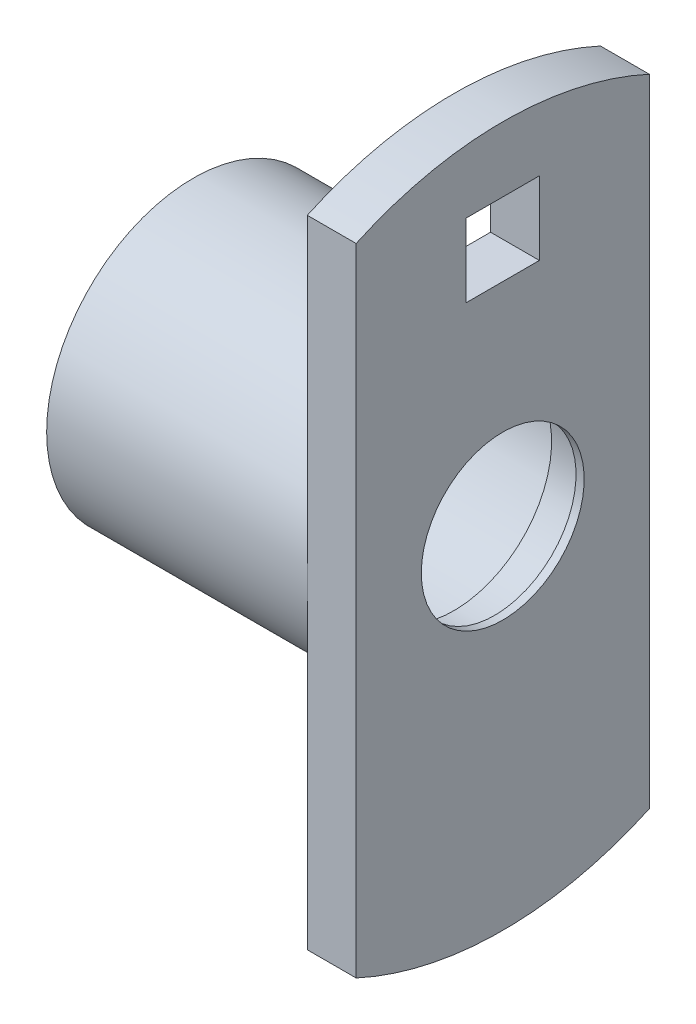
ISO-10303-21;
HEADER;
FILE_DESCRIPTION(('STEP AP214'),'2;1');
FILE_NAME('part.step','',(''),(''),'','','');
FILE_SCHEMA(('AUTOMOTIVE_DESIGN { 1 0 10303 214 1 1 1 1 }'));
ENDSEC;
DATA;
#1=APPLICATION_CONTEXT('core data for automotive mechanical design processes');
#2=APPLICATION_PROTOCOL_DEFINITION('international standard','automotive_design',2000,#1);
#3=PRODUCT_CONTEXT('',#1,'mechanical');
#4=PRODUCT('Part','Part','',(#3));
#5=PRODUCT_RELATED_PRODUCT_CATEGORY('part','',(#4));
#6=PRODUCT_DEFINITION_FORMATION('','',#4);
#7=PRODUCT_DEFINITION_CONTEXT('part definition',#1,'design');
#8=PRODUCT_DEFINITION('design','',#6,#7);
#9=PRODUCT_DEFINITION_SHAPE('','',#8);
#10=(LENGTH_UNIT() NAMED_UNIT(*) SI_UNIT(.MILLI.,.METRE.));
#11=(NAMED_UNIT(*) PLANE_ANGLE_UNIT() SI_UNIT($,.RADIAN.));
#12=(NAMED_UNIT(*) SI_UNIT($,.STERADIAN.) SOLID_ANGLE_UNIT());
#13=UNCERTAINTY_MEASURE_WITH_UNIT(LENGTH_MEASURE(1.E-05),#10,'distance_accuracy_value','');
#14=(GEOMETRIC_REPRESENTATION_CONTEXT(3) GLOBAL_UNCERTAINTY_ASSIGNED_CONTEXT((#13)) GLOBAL_UNIT_ASSIGNED_CONTEXT((#10,
#11,#12)) REPRESENTATION_CONTEXT('',''));
#15=CARTESIAN_POINT('',(0.,0.,0.));
#16=DIRECTION('',(0.,0.,1.));
#17=DIRECTION('',(1.,0.,0.));
#18=AXIS2_PLACEMENT_3D('',#15,#16,#17);
#19=CARTESIAN_POINT('',(0.,43.,0.));
#20=DIRECTION('',(-1.,0.,0.));
#21=DIRECTION('',(0.,0.,1.));
#22=AXIS2_PLACEMENT_3D('',#19,#20,#21);
#23=PLANE('',#22);
#24=CARTESIAN_POINT('',(0.,0.,0.));
#25=DIRECTION('',(-1.,0.,0.));
#26=DIRECTION('',(0.,0.,1.));
#27=AXIS2_PLACEMENT_3D('',#24,#25,#26);
#28=CIRCLE('',#27,10.);
#29=CARTESIAN_POINT('',(0.,0.,10.));
#30=VERTEX_POINT('',#29);
#31=EDGE_CURVE('E53',#30,#30,#28,.T.);
#32=ORIENTED_EDGE('',*,*,#31,.T.);
#33=EDGE_LOOP('',(#32));
#34=FACE_BOUND('',#33,.T.);
#35=DIRECTION('',(0.,1.,0.));
#36=VECTOR('',#35,1.);
#37=CARTESIAN_POINT('',(0.,0.,-4.5));
#38=LINE('',#37,#36);
#39=CARTESIAN_POINT('',(0.,26.,-4.5));
#40=VERTEX_POINT('',#39);
#41=CARTESIAN_POINT('',(0.,35.,-4.5));
#42=VERTEX_POINT('',#41);
#43=EDGE_CURVE('E192',#40,#42,#38,.T.);
#44=ORIENTED_EDGE('',*,*,#43,.F.);
#45=DIRECTION('',(0.,0.,-1.));
#46=VECTOR('',#45,1.);
#47=CARTESIAN_POINT('',(0.,26.,0.));
#48=LINE('',#47,#46);
#49=CARTESIAN_POINT('',(0.,26.,4.5));
#50=VERTEX_POINT('',#49);
#51=EDGE_CURVE('E60',#50,#40,#48,.T.);
#52=ORIENTED_EDGE('',*,*,#51,.F.);
#53=DIRECTION('',(0.,1.,0.));
#54=VECTOR('',#53,1.);
#55=CARTESIAN_POINT('',(0.,0.,4.5));
#56=LINE('',#55,#54);
#57=CARTESIAN_POINT('',(0.,35.,4.5));
#58=VERTEX_POINT('',#57);
#59=EDGE_CURVE('E180',#50,#58,#56,.T.);
#60=ORIENTED_EDGE('',*,*,#59,.T.);
#61=DIRECTION('',(0.,0.,-1.));
#62=VECTOR('',#61,1.);
#63=CARTESIAN_POINT('',(0.,35.,0.));
#64=LINE('',#63,#62);
#65=EDGE_CURVE('E189',#58,#42,#64,.T.);
#66=ORIENTED_EDGE('',*,*,#65,.T.);
#67=EDGE_LOOP('',(#44,#52,#60,#66));
#68=FACE_BOUND('',#67,.T.);
#69=DIRECTION('',(0.,-1.,0.));
#70=VECTOR('',#69,1.);
#71=CARTESIAN_POINT('',(0.,0.,18.));
#72=LINE('',#71,#70);
#73=CARTESIAN_POINT('',(0.,39.0512483795333,18.));
#74=VERTEX_POINT('',#73);
#75=CARTESIAN_POINT('',(0.,-39.0512483795333,18.));
#76=VERTEX_POINT('',#75);
#77=EDGE_CURVE('E116',#74,#76,#72,.T.);
#78=ORIENTED_EDGE('',*,*,#77,.T.);
#79=CARTESIAN_POINT('',(0.,0.,0.));
#80=DIRECTION('',(-1.,0.,0.));
#81=DIRECTION('',(0.,0.,1.));
#82=AXIS2_PLACEMENT_3D('',#79,#80,#81);
#83=CIRCLE('',#82,43.);
#84=CARTESIAN_POINT('',(0.,-39.0512483795333,-18.));
#85=VERTEX_POINT('',#84);
#86=EDGE_CURVE('E140',#85,#76,#83,.T.);
#87=ORIENTED_EDGE('',*,*,#86,.F.);
#88=DIRECTION('',(0.,1.,0.));
#89=VECTOR('',#88,1.);
#90=CARTESIAN_POINT('',(0.,0.,-18.));
#91=LINE('',#90,#89);
#92=CARTESIAN_POINT('',(0.,39.0512483795333,-18.));
#93=VERTEX_POINT('',#92);
#94=EDGE_CURVE('E139',#85,#93,#91,.T.);
#95=ORIENTED_EDGE('',*,*,#94,.T.);
#96=EDGE_CURVE('E134',#74,#93,#83,.T.);
#97=ORIENTED_EDGE('',*,*,#96,.F.);
#98=EDGE_LOOP('',(#78,#87,#95,#97));
#99=FACE_BOUND('',#98,.T.);
#100=ADVANCED_FACE('F45',(#34,#68,#99),#23,.F.);
#101=CARTESIAN_POINT('',(-42.8095708761898,0.,0.));
#102=DIRECTION('',(-1.,0.,0.));
#103=DIRECTION('',(0.,0.,1.));
#104=AXIS2_PLACEMENT_3D('',#101,#102,#103);
#105=CYLINDRICAL_SURFACE('',#104,43.);
#106=DIRECTION('',(1.,0.,0.));
#107=VECTOR('',#106,1.);
#108=CARTESIAN_POINT('',(-88.0060973342837,39.0512483795333,18.));
#109=LINE('',#108,#107);
#110=CARTESIAN_POINT('',(-6.00000000000001,39.0512483795333,18.));
#111=VERTEX_POINT('',#110);
#112=EDGE_CURVE('E119',#111,#74,#109,.T.);
#113=ORIENTED_EDGE('',*,*,#112,.T.);
#114=ORIENTED_EDGE('',*,*,#96,.T.);
#115=DIRECTION('',(1.,0.,0.));
#116=VECTOR('',#115,1.);
#117=CARTESIAN_POINT('',(-88.0060973342837,39.0512483795333,-18.));
#118=LINE('',#117,#116);
#119=CARTESIAN_POINT('',(-6.00000000000001,39.0512483795333,-18.));
#120=VERTEX_POINT('',#119);
#121=EDGE_CURVE('E169',#120,#93,#118,.T.);
#122=ORIENTED_EDGE('',*,*,#121,.F.);
#123=CARTESIAN_POINT('',(-6.00000000000001,0.,0.));
#124=DIRECTION('',(-1.,0.,0.));
#125=DIRECTION('',(0.,0.,1.));
#126=AXIS2_PLACEMENT_3D('',#123,#124,#125);
#127=CIRCLE('',#126,43.);
#128=EDGE_CURVE('E136',#111,#120,#127,.T.);
#129=ORIENTED_EDGE('',*,*,#128,.F.);
#130=EDGE_LOOP('',(#113,#114,#122,#129));
#131=FACE_BOUND('',#130,.T.);
#132=ADVANCED_FACE('F132',(#131),#105,.T.);
#133=DIRECTION('',(1.,0.,0.));
#134=VECTOR('',#133,1.);
#135=CARTESIAN_POINT('',(-88.0060973342837,-39.0512483795333,18.));
#136=LINE('',#135,#134);
#137=CARTESIAN_POINT('',(-6.00000000000001,-39.0512483795333,18.));
#138=VERTEX_POINT('',#137);
#139=EDGE_CURVE('E122',#138,#76,#136,.T.);
#140=ORIENTED_EDGE('',*,*,#139,.F.);
#141=CARTESIAN_POINT('',(-6.00000000000001,-39.0512483795333,-18.));
#142=VERTEX_POINT('',#141);
#143=EDGE_CURVE('E145',#142,#138,#127,.T.);
#144=ORIENTED_EDGE('',*,*,#143,.F.);
#145=DIRECTION('',(1.,0.,0.));
#146=VECTOR('',#145,1.);
#147=CARTESIAN_POINT('',(-88.0060973342837,-39.0512483795333,-18.));
#148=LINE('',#147,#146);
#149=EDGE_CURVE('E166',#142,#85,#148,.T.);
#150=ORIENTED_EDGE('',*,*,#149,.T.);
#151=ORIENTED_EDGE('',*,*,#86,.T.);
#152=EDGE_LOOP('',(#140,#144,#150,#151));
#153=FACE_BOUND('',#152,.T.);
#154=ADVANCED_FACE('F213',(#153),#105,.T.);
#155=CARTESIAN_POINT('',(-6.,18.,0.));
#156=DIRECTION('',(1.,0.,0.));
#157=DIRECTION('',(0.,0.,-1.));
#158=AXIS2_PLACEMENT_3D('',#155,#156,#157);
#159=PLANE('',#158);
#160=DIRECTION('',(0.,-1.,0.));
#161=VECTOR('',#160,1.);
#162=CARTESIAN_POINT('',(-6.00000000000001,0.,4.5));
#163=LINE('',#162,#161);
#164=CARTESIAN_POINT('',(-6.00000000000001,35.,4.5));
#165=VERTEX_POINT('',#164);
#166=CARTESIAN_POINT('',(-6.00000000000001,26.,4.5));
#167=VERTEX_POINT('',#166);
#168=EDGE_CURVE('E196',#165,#167,#163,.T.);
#169=ORIENTED_EDGE('',*,*,#168,.T.);
#170=DIRECTION('',(0.,0.,1.));
#171=VECTOR('',#170,1.);
#172=CARTESIAN_POINT('',(-6.00000000000001,26.,0.));
#173=LINE('',#172,#171);
#174=CARTESIAN_POINT('',(-6.00000000000001,26.,-4.5));
#175=VERTEX_POINT('',#174);
#176=EDGE_CURVE('E177',#175,#167,#173,.T.);
#177=ORIENTED_EDGE('',*,*,#176,.F.);
#178=DIRECTION('',(0.,-1.,0.));
#179=VECTOR('',#178,1.);
#180=CARTESIAN_POINT('',(-6.00000000000001,0.,-4.5));
#181=LINE('',#180,#179);
#182=CARTESIAN_POINT('',(-6.,35.,-4.5));
#183=VERTEX_POINT('',#182);
#184=EDGE_CURVE('E127',#183,#175,#181,.T.);
#185=ORIENTED_EDGE('',*,*,#184,.F.);
#186=DIRECTION('',(0.,0.,1.));
#187=VECTOR('',#186,1.);
#188=CARTESIAN_POINT('',(-6.00000000000001,35.,0.));
#189=LINE('',#188,#187);
#190=EDGE_CURVE('E186',#183,#165,#189,.T.);
#191=ORIENTED_EDGE('',*,*,#190,.T.);
#192=EDGE_LOOP('',(#169,#177,#185,#191));
#193=FACE_BOUND('',#192,.T.);
#194=DIRECTION('',(0.,1.,0.));
#195=VECTOR('',#194,1.);
#196=CARTESIAN_POINT('',(-6.00000000000001,0.,18.));
#197=LINE('',#196,#195);
#198=CARTESIAN_POINT('',(-6.00000000000001,0.,18.));
#199=VERTEX_POINT('',#198);
#200=EDGE_CURVE('E201',#199,#111,#197,.T.);
#201=ORIENTED_EDGE('',*,*,#200,.T.);
#202=ORIENTED_EDGE('',*,*,#128,.T.);
#203=DIRECTION('',(0.,-1.,0.));
#204=VECTOR('',#203,1.);
#205=CARTESIAN_POINT('',(-6.00000000000001,0.,-18.));
#206=LINE('',#205,#204);
#207=CARTESIAN_POINT('',(-6.00000000000001,0.,-18.));
#208=VERTEX_POINT('',#207);
#209=EDGE_CURVE('E173',#120,#208,#206,.T.);
#210=ORIENTED_EDGE('',*,*,#209,.T.);
#211=CARTESIAN_POINT('',(-6.00000000000001,0.,0.));
#212=DIRECTION('',(-1.,0.,0.));
#213=DIRECTION('',(0.,0.,1.));
#214=AXIS2_PLACEMENT_3D('',#211,#212,#213);
#215=CIRCLE('',#214,18.);
#216=EDGE_CURVE('E146',#199,#208,#215,.T.);
#217=ORIENTED_EDGE('',*,*,#216,.F.);
#218=EDGE_LOOP('',(#201,#202,#210,#217));
#219=FACE_BOUND('',#218,.T.);
#220=ADVANCED_FACE('F210',(#193,#219),#159,.F.);
#221=EDGE_CURVE('E165',#138,#199,#197,.T.);
#222=ORIENTED_EDGE('',*,*,#221,.T.);
#223=EDGE_CURVE('E149',#208,#199,#215,.T.);
#224=ORIENTED_EDGE('',*,*,#223,.F.);
#225=EDGE_CURVE('E171',#208,#142,#206,.T.);
#226=ORIENTED_EDGE('',*,*,#225,.T.);
#227=ORIENTED_EDGE('',*,*,#143,.T.);
#228=EDGE_LOOP('',(#222,#224,#226,#227));
#229=FACE_BOUND('',#228,.T.);
#230=ADVANCED_FACE('F215',(#229),#159,.F.);
#231=CARTESIAN_POINT('',(-1.,10.,0.));
#232=DIRECTION('',(1.,0.,0.));
#233=DIRECTION('',(0.,0.,-1.));
#234=AXIS2_PLACEMENT_3D('',#231,#232,#233);
#235=PLANE('',#234);
#236=CARTESIAN_POINT('',(-1.,0.,0.));
#237=DIRECTION('',(-1.,0.,0.));
#238=DIRECTION('',(0.,0.,1.));
#239=AXIS2_PLACEMENT_3D('',#236,#237,#238);
#240=CIRCLE('',#239,10.);
#241=CARTESIAN_POINT('',(-1.,0.,10.));
#242=VERTEX_POINT('',#241);
#243=EDGE_CURVE('E13',#242,#242,#240,.T.);
#244=ORIENTED_EDGE('',*,*,#243,.F.);
#245=EDGE_LOOP('',(#244));
#246=FACE_BOUND('',#245,.T.);
#247=CARTESIAN_POINT('',(-1.,0.,0.));
#248=DIRECTION('',(-1.,0.,0.));
#249=DIRECTION('',(0.,0.,1.));
#250=AXIS2_PLACEMENT_3D('',#247,#248,#249);
#251=CIRCLE('',#250,12.);
#252=CARTESIAN_POINT('',(-1.,0.,12.));
#253=VERTEX_POINT('',#252);
#254=EDGE_CURVE('E162',#253,#253,#251,.T.);
#255=ORIENTED_EDGE('',*,*,#254,.T.);
#256=EDGE_LOOP('',(#255));
#257=FACE_BOUND('',#256,.T.);
#258=ADVANCED_FACE('F47',(#246,#257),#235,.F.);
#259=CARTESIAN_POINT('',(-42.8095708761898,0.,0.));
#260=DIRECTION('',(-1.,0.,0.));
#261=DIRECTION('',(0.,0.,1.));
#262=AXIS2_PLACEMENT_3D('',#259,#260,#261);
#263=CYLINDRICAL_SURFACE('',#262,10.);
#264=ORIENTED_EDGE('',*,*,#31,.F.);
#265=EDGE_LOOP('',(#264));
#266=FACE_BOUND('',#265,.T.);
#267=ORIENTED_EDGE('',*,*,#243,.T.);
#268=EDGE_LOOP('',(#267));
#269=FACE_BOUND('',#268,.T.);
#270=ADVANCED_FACE('F240',(#266,#269),#263,.F.);
#271=CARTESIAN_POINT('',(-42.8095708761898,0.,0.));
#272=DIRECTION('',(-1.,0.,0.));
#273=DIRECTION('',(0.,0.,1.));
#274=AXIS2_PLACEMENT_3D('',#271,#272,#273);
#275=CYLINDRICAL_SURFACE('',#274,18.);
#276=CARTESIAN_POINT('',(-38.,0.,0.));
#277=DIRECTION('',(-1.,0.,0.));
#278=DIRECTION('',(0.,0.,1.));
#279=AXIS2_PLACEMENT_3D('',#276,#277,#278);
#280=CIRCLE('',#279,18.);
#281=CARTESIAN_POINT('',(-38.,0.,18.));
#282=VERTEX_POINT('',#281);
#283=EDGE_CURVE('E150',#282,#282,#280,.T.);
#284=ORIENTED_EDGE('',*,*,#283,.F.);
#285=EDGE_LOOP('',(#284));
#286=FACE_BOUND('',#285,.T.);
#287=ORIENTED_EDGE('',*,*,#216,.T.);
#288=ORIENTED_EDGE('',*,*,#223,.T.);
#289=EDGE_LOOP('',(#287,#288));
#290=FACE_BOUND('',#289,.T.);
#291=ADVANCED_FACE('F242',(#286,#290),#275,.T.);
#292=CARTESIAN_POINT('',(-38.,16.,0.));
#293=DIRECTION('',(1.,0.,0.));
#294=DIRECTION('',(0.,0.,-1.));
#295=AXIS2_PLACEMENT_3D('',#292,#293,#294);
#296=PLANE('',#295);
#297=CARTESIAN_POINT('',(-38.,0.,0.));
#298=DIRECTION('',(-1.,0.,0.));
#299=DIRECTION('',(0.,0.,1.));
#300=AXIS2_PLACEMENT_3D('',#297,#298,#299);
#301=CIRCLE('',#300,16.);
#302=CARTESIAN_POINT('',(-38.,0.,16.));
#303=VERTEX_POINT('',#302);
#304=EDGE_CURVE('E153',#303,#303,#301,.T.);
#305=ORIENTED_EDGE('',*,*,#304,.F.);
#306=EDGE_LOOP('',(#305));
#307=FACE_BOUND('',#306,.T.);
#308=ORIENTED_EDGE('',*,*,#283,.T.);
#309=EDGE_LOOP('',(#308));
#310=FACE_BOUND('',#309,.T.);
#311=ADVANCED_FACE('F248',(#307,#310),#296,.F.);
#312=CARTESIAN_POINT('',(-42.8095708761898,0.,0.));
#313=DIRECTION('',(-1.,0.,0.));
#314=DIRECTION('',(0.,0.,1.));
#315=AXIS2_PLACEMENT_3D('',#312,#313,#314);
#316=CYLINDRICAL_SURFACE('',#315,16.);
#317=CARTESIAN_POINT('',(-6.,0.,0.));
#318=DIRECTION('',(-1.,0.,0.));
#319=DIRECTION('',(0.,0.,1.));
#320=AXIS2_PLACEMENT_3D('',#317,#318,#319);
#321=CIRCLE('',#320,16.);
#322=CARTESIAN_POINT('',(-6.,0.,16.));
#323=VERTEX_POINT('',#322);
#324=EDGE_CURVE('E156',#323,#323,#321,.T.);
#325=ORIENTED_EDGE('',*,*,#324,.F.);
#326=EDGE_LOOP('',(#325));
#327=FACE_BOUND('',#326,.T.);
#328=ORIENTED_EDGE('',*,*,#304,.T.);
#329=EDGE_LOOP('',(#328));
#330=FACE_BOUND('',#329,.T.);
#331=ADVANCED_FACE('F262',(#327,#330),#316,.F.);
#332=CARTESIAN_POINT('',(-6.,12.,0.));
#333=DIRECTION('',(1.,0.,0.));
#334=DIRECTION('',(0.,0.,-1.));
#335=AXIS2_PLACEMENT_3D('',#332,#333,#334);
#336=PLANE('',#335);
#337=CARTESIAN_POINT('',(-6.,0.,0.));
#338=DIRECTION('',(-1.,0.,0.));
#339=DIRECTION('',(0.,0.,1.));
#340=AXIS2_PLACEMENT_3D('',#337,#338,#339);
#341=CIRCLE('',#340,12.);
#342=CARTESIAN_POINT('',(-6.,0.,12.));
#343=VERTEX_POINT('',#342);
#344=EDGE_CURVE('E159',#343,#343,#341,.T.);
#345=ORIENTED_EDGE('',*,*,#344,.F.);
#346=EDGE_LOOP('',(#345));
#347=FACE_BOUND('',#346,.T.);
#348=ORIENTED_EDGE('',*,*,#324,.T.);
#349=EDGE_LOOP('',(#348));
#350=FACE_BOUND('',#349,.T.);
#351=ADVANCED_FACE('F228',(#347,#350),#336,.F.);
#352=CARTESIAN_POINT('',(-42.8095708761898,0.,0.));
#353=DIRECTION('',(-1.,0.,0.));
#354=DIRECTION('',(0.,0.,1.));
#355=AXIS2_PLACEMENT_3D('',#352,#353,#354);
#356=CYLINDRICAL_SURFACE('',#355,12.);
#357=ORIENTED_EDGE('',*,*,#254,.F.);
#358=EDGE_LOOP('',(#357));
#359=FACE_BOUND('',#358,.T.);
#360=ORIENTED_EDGE('',*,*,#344,.T.);
#361=EDGE_LOOP('',(#360));
#362=FACE_BOUND('',#361,.T.);
#363=ADVANCED_FACE('F220',(#359,#362),#356,.F.);
#364=CARTESIAN_POINT('',(-88.0060973342837,0.,-18.));
#365=DIRECTION('',(0.,0.,-1.));
#366=DIRECTION('',(-1.,0.,0.));
#367=AXIS2_PLACEMENT_3D('',#364,#365,#366);
#368=PLANE('',#367);
#369=ORIENTED_EDGE('',*,*,#121,.T.);
#370=ORIENTED_EDGE('',*,*,#94,.F.);
#371=ORIENTED_EDGE('',*,*,#149,.F.);
#372=ORIENTED_EDGE('',*,*,#225,.F.);
#373=ORIENTED_EDGE('',*,*,#209,.F.);
#374=EDGE_LOOP('',(#369,#370,#371,#372,#373));
#375=FACE_BOUND('',#374,.T.);
#376=ADVANCED_FACE('F217',(#375),#368,.T.);
#377=CARTESIAN_POINT('',(-88.0060973342837,26.,0.));
#378=DIRECTION('',(0.,-1.,0.));
#379=DIRECTION('',(0.,0.,-1.));
#380=AXIS2_PLACEMENT_3D('',#377,#378,#379);
#381=PLANE('',#380);
#382=ORIENTED_EDGE('',*,*,#176,.T.);
#383=DIRECTION('',(1.,0.,0.));
#384=VECTOR('',#383,1.);
#385=CARTESIAN_POINT('',(-88.0060973342837,26.,4.5));
#386=LINE('',#385,#384);
#387=EDGE_CURVE('E184',#167,#50,#386,.T.);
#388=ORIENTED_EDGE('',*,*,#387,.T.);
#389=ORIENTED_EDGE('',*,*,#51,.T.);
#390=DIRECTION('',(1.,0.,0.));
#391=VECTOR('',#390,1.);
#392=CARTESIAN_POINT('',(-88.0060973342837,26.,-4.5));
#393=LINE('',#392,#391);
#394=EDGE_CURVE('E178',#175,#40,#393,.T.);
#395=ORIENTED_EDGE('',*,*,#394,.F.);
#396=EDGE_LOOP('',(#382,#388,#389,#395));
#397=FACE_BOUND('',#396,.T.);
#398=ADVANCED_FACE('F219',(#397),#381,.F.);
#399=CARTESIAN_POINT('',(-88.0060973342837,0.,4.5));
#400=DIRECTION('',(0.,0.,-1.));
#401=DIRECTION('',(-1.,0.,0.));
#402=AXIS2_PLACEMENT_3D('',#399,#400,#401);
#403=PLANE('',#402);
#404=DIRECTION('',(1.,0.,0.));
#405=VECTOR('',#404,1.);
#406=CARTESIAN_POINT('',(-88.0060973342837,35.,4.5));
#407=LINE('',#406,#405);
#408=EDGE_CURVE('E182',#165,#58,#407,.T.);
#409=ORIENTED_EDGE('',*,*,#408,.T.);
#410=ORIENTED_EDGE('',*,*,#59,.F.);
#411=ORIENTED_EDGE('',*,*,#387,.F.);
#412=ORIENTED_EDGE('',*,*,#168,.F.);
#413=EDGE_LOOP('',(#409,#410,#411,#412));
#414=FACE_BOUND('',#413,.T.);
#415=ADVANCED_FACE('F226',(#414),#403,.T.);
#416=CARTESIAN_POINT('',(-88.0060973342837,35.,0.));
#417=DIRECTION('',(0.,-1.,0.));
#418=DIRECTION('',(0.,0.,-1.));
#419=AXIS2_PLACEMENT_3D('',#416,#417,#418);
#420=PLANE('',#419);
#421=DIRECTION('',(1.,0.,0.));
#422=VECTOR('',#421,1.);
#423=CARTESIAN_POINT('',(-88.0060973342837,35.,-4.5));
#424=LINE('',#423,#422);
#425=EDGE_CURVE('E68',#183,#42,#424,.T.);
#426=ORIENTED_EDGE('',*,*,#425,.T.);
#427=ORIENTED_EDGE('',*,*,#65,.F.);
#428=ORIENTED_EDGE('',*,*,#408,.F.);
#429=ORIENTED_EDGE('',*,*,#190,.F.);
#430=EDGE_LOOP('',(#426,#427,#428,#429));
#431=FACE_BOUND('',#430,.T.);
#432=ADVANCED_FACE('F292',(#431),#420,.T.);
#433=CARTESIAN_POINT('',(-88.0060973342837,0.,-4.5));
#434=DIRECTION('',(0.,0.,-1.));
#435=DIRECTION('',(-1.,0.,0.));
#436=AXIS2_PLACEMENT_3D('',#433,#434,#435);
#437=PLANE('',#436);
#438=ORIENTED_EDGE('',*,*,#184,.T.);
#439=ORIENTED_EDGE('',*,*,#394,.T.);
#440=ORIENTED_EDGE('',*,*,#43,.T.);
#441=ORIENTED_EDGE('',*,*,#425,.F.);
#442=EDGE_LOOP('',(#438,#439,#440,#441));
#443=FACE_BOUND('',#442,.T.);
#444=ADVANCED_FACE('F294',(#443),#437,.F.);
#445=CARTESIAN_POINT('',(-88.0060973342837,0.,18.));
#446=DIRECTION('',(0.,0.,1.));
#447=DIRECTION('',(1.,0.,0.));
#448=AXIS2_PLACEMENT_3D('',#445,#446,#447);
#449=PLANE('',#448);
#450=ORIENTED_EDGE('',*,*,#139,.T.);
#451=ORIENTED_EDGE('',*,*,#77,.F.);
#452=ORIENTED_EDGE('',*,*,#112,.F.);
#453=ORIENTED_EDGE('',*,*,#200,.F.);
#454=ORIENTED_EDGE('',*,*,#221,.F.);
#455=EDGE_LOOP('',(#450,#451,#452,#453,#454));
#456=FACE_BOUND('',#455,.T.);
#457=ADVANCED_FACE('F118',(#456),#449,.T.);
#458=CLOSED_SHELL('',(#100,#132,#154,#220,#230,#258,#270,#291,#311,#331,#351,#363,#376,#398,
#415,#432,#444,#457));
#459=MANIFOLD_SOLID_BREP('B2',#458);
#460=ADVANCED_BREP_SHAPE_REPRESENTATION('',(#18,#459),#14);
#461=SHAPE_DEFINITION_REPRESENTATION(#9,#460);
ENDSEC;
END-ISO-10303-21;
